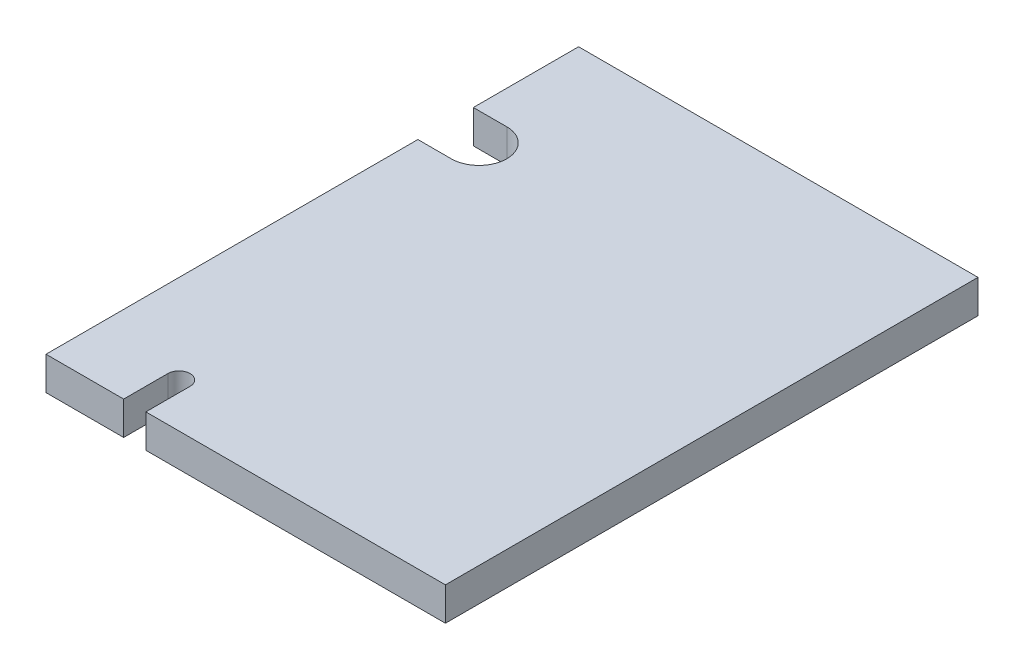
ISO-10303-21;
HEADER;
FILE_DESCRIPTION(('STEP AP214'),'2;1');
FILE_NAME('part.step','',(''),(''),'','','');
FILE_SCHEMA(('AUTOMOTIVE_DESIGN { 1 0 10303 214 1 1 1 1 }'));
ENDSEC;
DATA;
#1=APPLICATION_CONTEXT('core data for automotive mechanical design processes');
#2=APPLICATION_PROTOCOL_DEFINITION('international standard','automotive_design',2000,#1);
#3=PRODUCT_CONTEXT('',#1,'mechanical');
#4=PRODUCT('Part','Part','',(#3));
#5=PRODUCT_RELATED_PRODUCT_CATEGORY('part','',(#4));
#6=PRODUCT_DEFINITION_FORMATION('','',#4);
#7=PRODUCT_DEFINITION_CONTEXT('part definition',#1,'design');
#8=PRODUCT_DEFINITION('design','',#6,#7);
#9=PRODUCT_DEFINITION_SHAPE('','',#8);
#10=(LENGTH_UNIT() NAMED_UNIT(*) SI_UNIT(.MILLI.,.METRE.));
#11=(NAMED_UNIT(*) PLANE_ANGLE_UNIT() SI_UNIT($,.RADIAN.));
#12=(NAMED_UNIT(*) SI_UNIT($,.STERADIAN.) SOLID_ANGLE_UNIT());
#13=UNCERTAINTY_MEASURE_WITH_UNIT(LENGTH_MEASURE(1.E-05),#10,'distance_accuracy_value','');
#14=(GEOMETRIC_REPRESENTATION_CONTEXT(3) GLOBAL_UNCERTAINTY_ASSIGNED_CONTEXT((#13)) GLOBAL_UNIT_ASSIGNED_CONTEXT((#10,
#11,#12)) REPRESENTATION_CONTEXT('',''));
#15=CARTESIAN_POINT('',(0.,0.,0.));
#16=DIRECTION('',(0.,0.,1.));
#17=DIRECTION('',(1.,0.,0.));
#18=AXIS2_PLACEMENT_3D('',#15,#16,#17);
#19=CARTESIAN_POINT('',(0.,19.05,0.));
#20=DIRECTION('',(1.,0.,0.));
#21=DIRECTION('',(0.,0.,-1.));
#22=AXIS2_PLACEMENT_3D('',#19,#20,#21);
#23=PLANE('',#22);
#24=DIRECTION('',(0.,-1.,0.));
#25=VECTOR('',#24,1.);
#26=CARTESIAN_POINT('',(0.,19.05,-244.582325894495));
#27=LINE('',#26,#25);
#28=CARTESIAN_POINT('',(0.,19.05,-244.582325894495));
#29=VERTEX_POINT('',#28);
#30=CARTESIAN_POINT('',(0.,0.,-244.582325894495));
#31=VERTEX_POINT('',#30);
#32=EDGE_CURVE('E161',#29,#31,#27,.T.);
#33=ORIENTED_EDGE('',*,*,#32,.F.);
#34=DIRECTION('',(0.,0.,1.));
#35=VECTOR('',#34,1.);
#36=CARTESIAN_POINT('',(0.,19.05,0.));
#37=LINE('',#36,#35);
#38=CARTESIAN_POINT('',(0.,19.05,-304.8));
#39=VERTEX_POINT('',#38);
#40=EDGE_CURVE('E190',#39,#29,#37,.T.);
#41=ORIENTED_EDGE('',*,*,#40,.F.);
#42=DIRECTION('',(0.,-1.,0.));
#43=VECTOR('',#42,1.);
#44=CARTESIAN_POINT('',(0.,19.05,-304.8));
#45=LINE('',#44,#43);
#46=CARTESIAN_POINT('',(0.,0.,-304.8));
#47=VERTEX_POINT('',#46);
#48=EDGE_CURVE('E196',#39,#47,#45,.T.);
#49=ORIENTED_EDGE('',*,*,#48,.T.);
#50=DIRECTION('',(0.,0.,1.));
#51=VECTOR('',#50,1.);
#52=CARTESIAN_POINT('',(0.,0.,0.));
#53=LINE('',#52,#51);
#54=EDGE_CURVE('E200',#47,#31,#53,.T.);
#55=ORIENTED_EDGE('',*,*,#54,.T.);
#56=EDGE_LOOP('',(#33,#41,#49,#55));
#57=FACE_BOUND('',#56,.T.);
#58=ADVANCED_FACE('F39',(#57),#23,.F.);
#59=CARTESIAN_POINT('',(0.,19.05,0.));
#60=DIRECTION('',(0.,0.,-1.));
#61=DIRECTION('',(-1.,0.,0.));
#62=AXIS2_PLACEMENT_3D('',#59,#60,#61);
#63=PLANE('',#62);
#64=DIRECTION('',(0.,-1.,0.));
#65=VECTOR('',#64,1.);
#66=CARTESIAN_POINT('',(44.4494979671798,19.05,0.));
#67=LINE('',#66,#65);
#68=CARTESIAN_POINT('',(44.4494979671798,19.05,0.));
#69=VERTEX_POINT('',#68);
#70=CARTESIAN_POINT('',(44.4494979671798,0.,0.));
#71=VERTEX_POINT('',#70);
#72=EDGE_CURVE('E168',#69,#71,#67,.T.);
#73=ORIENTED_EDGE('',*,*,#72,.F.);
#74=DIRECTION('',(1.,0.,0.));
#75=VECTOR('',#74,1.);
#76=CARTESIAN_POINT('',(0.,19.05,0.));
#77=LINE('',#76,#75);
#78=CARTESIAN_POINT('',(0.,19.05,0.));
#79=VERTEX_POINT('',#78);
#80=EDGE_CURVE('E192',#79,#69,#77,.T.);
#81=ORIENTED_EDGE('',*,*,#80,.F.);
#82=DIRECTION('',(0.,-1.,0.));
#83=VECTOR('',#82,1.);
#84=CARTESIAN_POINT('',(0.,19.05,0.));
#85=LINE('',#84,#83);
#86=CARTESIAN_POINT('',(0.,0.,0.));
#87=VERTEX_POINT('',#86);
#88=EDGE_CURVE('E11',#79,#87,#85,.T.);
#89=ORIENTED_EDGE('',*,*,#88,.T.);
#90=DIRECTION('',(1.,0.,0.));
#91=VECTOR('',#90,1.);
#92=CARTESIAN_POINT('',(0.,0.,0.));
#93=LINE('',#92,#91);
#94=EDGE_CURVE('E201',#87,#71,#93,.T.);
#95=ORIENTED_EDGE('',*,*,#94,.T.);
#96=EDGE_LOOP('',(#73,#81,#89,#95));
#97=FACE_BOUND('',#96,.T.);
#98=ADVANCED_FACE('F246',(#97),#63,.F.);
#99=CARTESIAN_POINT('',(0.,19.05,-212.832325894495));
#100=VERTEX_POINT('',#99);
#101=EDGE_CURVE('E188',#100,#79,#37,.T.);
#102=ORIENTED_EDGE('',*,*,#101,.F.);
#103=DIRECTION('',(0.,-1.,0.));
#104=VECTOR('',#103,1.);
#105=CARTESIAN_POINT('',(0.,19.05,-212.832325894495));
#106=LINE('',#105,#104);
#107=CARTESIAN_POINT('',(0.,0.,-212.832325894495));
#108=VERTEX_POINT('',#107);
#109=EDGE_CURVE('E140',#100,#108,#106,.T.);
#110=ORIENTED_EDGE('',*,*,#109,.T.);
#111=EDGE_CURVE('E159',#108,#87,#53,.T.);
#112=ORIENTED_EDGE('',*,*,#111,.T.);
#113=ORIENTED_EDGE('',*,*,#88,.F.);
#114=EDGE_LOOP('',(#102,#110,#112,#113));
#115=FACE_BOUND('',#114,.T.);
#116=ADVANCED_FACE('F41',(#115),#23,.F.);
#117=CARTESIAN_POINT('',(57.1494979671798,19.05,0.));
#118=VERTEX_POINT('',#117);
#119=CARTESIAN_POINT('',(228.6,19.05,0.));
#120=VERTEX_POINT('',#119);
#121=EDGE_CURVE('E186',#118,#120,#77,.T.);
#122=ORIENTED_EDGE('',*,*,#121,.F.);
#123=DIRECTION('',(0.,-1.,0.));
#124=VECTOR('',#123,1.);
#125=CARTESIAN_POINT('',(57.1494979671798,19.05,0.));
#126=LINE('',#125,#124);
#127=CARTESIAN_POINT('',(57.1494979671798,0.,0.));
#128=VERTEX_POINT('',#127);
#129=EDGE_CURVE('E170',#118,#128,#126,.T.);
#130=ORIENTED_EDGE('',*,*,#129,.T.);
#131=CARTESIAN_POINT('',(228.6,0.,0.));
#132=VERTEX_POINT('',#131);
#133=EDGE_CURVE('E205',#128,#132,#93,.T.);
#134=ORIENTED_EDGE('',*,*,#133,.T.);
#135=DIRECTION('',(0.,-1.,0.));
#136=VECTOR('',#135,1.);
#137=CARTESIAN_POINT('',(228.6,19.05,0.));
#138=LINE('',#137,#136);
#139=EDGE_CURVE('E50',#120,#132,#138,.T.);
#140=ORIENTED_EDGE('',*,*,#139,.F.);
#141=EDGE_LOOP('',(#122,#130,#134,#140));
#142=FACE_BOUND('',#141,.T.);
#143=ADVANCED_FACE('F240',(#142),#63,.F.);
#144=CARTESIAN_POINT('',(228.6,19.05,0.));
#145=DIRECTION('',(-1.,0.,0.));
#146=DIRECTION('',(0.,0.,1.));
#147=AXIS2_PLACEMENT_3D('',#144,#145,#146);
#148=PLANE('',#147);
#149=DIRECTION('',(0.,0.,-1.));
#150=VECTOR('',#149,1.);
#151=CARTESIAN_POINT('',(228.6,0.,0.));
#152=LINE('',#151,#150);
#153=CARTESIAN_POINT('',(228.6,0.,-304.8));
#154=VERTEX_POINT('',#153);
#155=EDGE_CURVE('E206',#132,#154,#152,.T.);
#156=ORIENTED_EDGE('',*,*,#155,.T.);
#157=DIRECTION('',(0.,-1.,0.));
#158=VECTOR('',#157,1.);
#159=CARTESIAN_POINT('',(228.6,19.05,-304.8));
#160=LINE('',#159,#158);
#161=CARTESIAN_POINT('',(228.6,19.05,-304.8));
#162=VERTEX_POINT('',#161);
#163=EDGE_CURVE('E215',#162,#154,#160,.T.);
#164=ORIENTED_EDGE('',*,*,#163,.F.);
#165=DIRECTION('',(0.,0.,-1.));
#166=VECTOR('',#165,1.);
#167=CARTESIAN_POINT('',(228.6,19.05,0.));
#168=LINE('',#167,#166);
#169=EDGE_CURVE('E191',#120,#162,#168,.T.);
#170=ORIENTED_EDGE('',*,*,#169,.F.);
#171=ORIENTED_EDGE('',*,*,#139,.T.);
#172=EDGE_LOOP('',(#156,#164,#170,#171));
#173=FACE_BOUND('',#172,.T.);
#174=ADVANCED_FACE('F218',(#173),#148,.F.);
#175=CARTESIAN_POINT('',(0.,19.05,-304.8));
#176=DIRECTION('',(0.,0.,1.));
#177=DIRECTION('',(1.,0.,0.));
#178=AXIS2_PLACEMENT_3D('',#175,#176,#177);
#179=PLANE('',#178);
#180=DIRECTION('',(-1.,0.,0.));
#181=VECTOR('',#180,1.);
#182=CARTESIAN_POINT('',(0.,0.,-304.8));
#183=LINE('',#182,#181);
#184=EDGE_CURVE('E208',#154,#47,#183,.T.);
#185=ORIENTED_EDGE('',*,*,#184,.T.);
#186=ORIENTED_EDGE('',*,*,#48,.F.);
#187=DIRECTION('',(-1.,0.,0.));
#188=VECTOR('',#187,1.);
#189=CARTESIAN_POINT('',(0.,19.05,-304.8));
#190=LINE('',#189,#188);
#191=EDGE_CURVE('E198',#162,#39,#190,.T.);
#192=ORIENTED_EDGE('',*,*,#191,.F.);
#193=ORIENTED_EDGE('',*,*,#163,.T.);
#194=EDGE_LOOP('',(#185,#186,#192,#193));
#195=FACE_BOUND('',#194,.T.);
#196=ADVANCED_FACE('F232',(#195),#179,.F.);
#197=CARTESIAN_POINT('',(0.,19.05,0.));
#198=DIRECTION('',(0.,-1.,0.));
#199=DIRECTION('',(0.,0.,-1.));
#200=AXIS2_PLACEMENT_3D('',#197,#198,#199);
#201=PLANE('',#200);
#202=ORIENTED_EDGE('',*,*,#40,.T.);
#203=DIRECTION('',(1.,0.,0.));
#204=VECTOR('',#203,1.);
#205=CARTESIAN_POINT('',(0.,19.05,-244.582325894495));
#206=LINE('',#205,#204);
#207=CARTESIAN_POINT('',(19.1254781425799,19.05,-244.582325894495));
#208=VERTEX_POINT('',#207);
#209=EDGE_CURVE('E139',#29,#208,#206,.T.);
#210=ORIENTED_EDGE('',*,*,#209,.T.);
#211=CARTESIAN_POINT('',(19.1254781425799,19.05,-228.707325894495));
#212=DIRECTION('',(0.,-1.,0.));
#213=DIRECTION('',(0.,0.,1.));
#214=AXIS2_PLACEMENT_3D('',#211,#212,#213);
#215=CIRCLE('',#214,15.875);
#216=CARTESIAN_POINT('',(19.1254781425799,19.05,-212.832325894495));
#217=VERTEX_POINT('',#216);
#218=EDGE_CURVE('E135',#208,#217,#215,.T.);
#219=ORIENTED_EDGE('',*,*,#218,.T.);
#220=DIRECTION('',(-1.,0.,0.));
#221=VECTOR('',#220,1.);
#222=CARTESIAN_POINT('',(19.1254781425799,19.05,-212.832325894495));
#223=LINE('',#222,#221);
#224=EDGE_CURVE('E143',#217,#100,#223,.T.);
#225=ORIENTED_EDGE('',*,*,#224,.T.);
#226=ORIENTED_EDGE('',*,*,#101,.T.);
#227=ORIENTED_EDGE('',*,*,#80,.T.);
#228=DIRECTION('',(0.,0.,-1.));
#229=VECTOR('',#228,1.);
#230=CARTESIAN_POINT('',(44.4494979671798,19.05,-25.3199300821902));
#231=LINE('',#230,#229);
#232=CARTESIAN_POINT('',(44.4494979671798,19.05,-25.3199300821902));
#233=VERTEX_POINT('',#232);
#234=EDGE_CURVE('E167',#69,#233,#231,.T.);
#235=ORIENTED_EDGE('',*,*,#234,.T.);
#236=CARTESIAN_POINT('',(50.7994979671798,19.05,-25.3199300821902));
#237=DIRECTION('',(0.,-1.,0.));
#238=DIRECTION('',(0.,0.,-1.));
#239=AXIS2_PLACEMENT_3D('',#236,#237,#238);
#240=CIRCLE('',#239,6.35);
#241=CARTESIAN_POINT('',(57.1494979671798,19.05,-25.3199300821902));
#242=VERTEX_POINT('',#241);
#243=EDGE_CURVE('E177',#233,#242,#240,.T.);
#244=ORIENTED_EDGE('',*,*,#243,.T.);
#245=DIRECTION('',(0.,0.,1.));
#246=VECTOR('',#245,1.);
#247=CARTESIAN_POINT('',(57.1494979671798,19.05,-25.3199300821902));
#248=LINE('',#247,#246);
#249=EDGE_CURVE('E185',#242,#118,#248,.T.);
#250=ORIENTED_EDGE('',*,*,#249,.T.);
#251=ORIENTED_EDGE('',*,*,#121,.T.);
#252=ORIENTED_EDGE('',*,*,#169,.T.);
#253=ORIENTED_EDGE('',*,*,#191,.T.);
#254=EDGE_LOOP('',(#202,#210,#219,#225,#226,#227,#235,#244,#250,#251,#252,#253));
#255=FACE_BOUND('',#254,.T.);
#256=ADVANCED_FACE('F149',(#255),#201,.F.);
#257=CARTESIAN_POINT('',(0.,0.,0.));
#258=DIRECTION('',(0.,-1.,0.));
#259=DIRECTION('',(0.,0.,-1.));
#260=AXIS2_PLACEMENT_3D('',#257,#258,#259);
#261=PLANE('',#260);
#262=DIRECTION('',(0.,0.,-1.));
#263=VECTOR('',#262,1.);
#264=CARTESIAN_POINT('',(44.4494979671798,0.,-25.3199300821902));
#265=LINE('',#264,#263);
#266=CARTESIAN_POINT('',(44.4494979671798,0.,-25.3199300821902));
#267=VERTEX_POINT('',#266);
#268=EDGE_CURVE('E65',#71,#267,#265,.T.);
#269=ORIENTED_EDGE('',*,*,#268,.F.);
#270=ORIENTED_EDGE('',*,*,#94,.F.);
#271=ORIENTED_EDGE('',*,*,#111,.F.);
#272=DIRECTION('',(-1.,0.,0.));
#273=VECTOR('',#272,1.);
#274=CARTESIAN_POINT('',(19.1254781425799,0.,-212.832325894495));
#275=LINE('',#274,#273);
#276=CARTESIAN_POINT('',(19.1254781425799,0.,-212.832325894495));
#277=VERTEX_POINT('',#276);
#278=EDGE_CURVE('E152',#277,#108,#275,.T.);
#279=ORIENTED_EDGE('',*,*,#278,.F.);
#280=CARTESIAN_POINT('',(19.1254781425799,0.,-228.707325894495));
#281=DIRECTION('',(0.,-1.,0.));
#282=DIRECTION('',(0.,0.,1.));
#283=AXIS2_PLACEMENT_3D('',#280,#281,#282);
#284=CIRCLE('',#283,15.875);
#285=CARTESIAN_POINT('',(19.1254781425799,0.,-244.582325894495));
#286=VERTEX_POINT('',#285);
#287=EDGE_CURVE('E131',#286,#277,#284,.T.);
#288=ORIENTED_EDGE('',*,*,#287,.F.);
#289=DIRECTION('',(1.,0.,0.));
#290=VECTOR('',#289,1.);
#291=CARTESIAN_POINT('',(0.,0.,-244.582325894495));
#292=LINE('',#291,#290);
#293=EDGE_CURVE('E53',#31,#286,#292,.T.);
#294=ORIENTED_EDGE('',*,*,#293,.F.);
#295=ORIENTED_EDGE('',*,*,#54,.F.);
#296=ORIENTED_EDGE('',*,*,#184,.F.);
#297=ORIENTED_EDGE('',*,*,#155,.F.);
#298=ORIENTED_EDGE('',*,*,#133,.F.);
#299=DIRECTION('',(0.,0.,1.));
#300=VECTOR('',#299,1.);
#301=CARTESIAN_POINT('',(57.1494979671798,0.,-25.3199300821902));
#302=LINE('',#301,#300);
#303=CARTESIAN_POINT('',(57.1494979671798,0.,-25.3199300821902));
#304=VERTEX_POINT('',#303);
#305=EDGE_CURVE('E173',#304,#128,#302,.T.);
#306=ORIENTED_EDGE('',*,*,#305,.F.);
#307=CARTESIAN_POINT('',(50.7994979671798,0.,-25.3199300821902));
#308=DIRECTION('',(0.,-1.,0.));
#309=DIRECTION('',(0.,0.,-1.));
#310=AXIS2_PLACEMENT_3D('',#307,#308,#309);
#311=CIRCLE('',#310,6.34999999999999);
#312=EDGE_CURVE('E156',#267,#304,#311,.T.);
#313=ORIENTED_EDGE('',*,*,#312,.F.);
#314=EDGE_LOOP('',(#269,#270,#271,#279,#288,#294,#295,#296,#297,#298,#306,#313));
#315=FACE_BOUND('',#314,.T.);
#316=ADVANCED_FACE('F227',(#315),#261,.T.);
#317=CARTESIAN_POINT('',(44.4494979671798,19.05,-25.3199300821902));
#318=DIRECTION('',(-1.,0.,0.));
#319=DIRECTION('',(0.,0.,1.));
#320=AXIS2_PLACEMENT_3D('',#317,#318,#319);
#321=PLANE('',#320);
#322=ORIENTED_EDGE('',*,*,#268,.T.);
#323=DIRECTION('',(0.,-1.,0.));
#324=VECTOR('',#323,1.);
#325=CARTESIAN_POINT('',(44.4494979671798,19.05,-25.3199300821902));
#326=LINE('',#325,#324);
#327=EDGE_CURVE('E175',#233,#267,#326,.T.);
#328=ORIENTED_EDGE('',*,*,#327,.F.);
#329=ORIENTED_EDGE('',*,*,#234,.F.);
#330=ORIENTED_EDGE('',*,*,#72,.T.);
#331=EDGE_LOOP('',(#322,#328,#329,#330));
#332=FACE_BOUND('',#331,.T.);
#333=ADVANCED_FACE('F243',(#332),#321,.F.);
#334=CARTESIAN_POINT('',(57.1494979671798,19.05,-25.3199300821902));
#335=DIRECTION('',(1.,0.,0.));
#336=DIRECTION('',(0.,0.,-1.));
#337=AXIS2_PLACEMENT_3D('',#334,#335,#336);
#338=PLANE('',#337);
#339=ORIENTED_EDGE('',*,*,#305,.T.);
#340=ORIENTED_EDGE('',*,*,#129,.F.);
#341=ORIENTED_EDGE('',*,*,#249,.F.);
#342=DIRECTION('',(0.,-1.,0.));
#343=VECTOR('',#342,1.);
#344=CARTESIAN_POINT('',(57.1494979671798,19.05,-25.3199300821902));
#345=LINE('',#344,#343);
#346=EDGE_CURVE('E163',#242,#304,#345,.T.);
#347=ORIENTED_EDGE('',*,*,#346,.T.);
#348=EDGE_LOOP('',(#339,#340,#341,#347));
#349=FACE_BOUND('',#348,.T.);
#350=ADVANCED_FACE('F239',(#349),#338,.F.);
#351=CARTESIAN_POINT('',(50.7994979671798,19.05,-25.3199300821902));
#352=DIRECTION('',(0.,-1.,0.));
#353=DIRECTION('',(0.,0.,-1.));
#354=AXIS2_PLACEMENT_3D('',#351,#352,#353);
#355=CYLINDRICAL_SURFACE('',#354,6.34999999999999);
#356=ORIENTED_EDGE('',*,*,#312,.T.);
#357=ORIENTED_EDGE('',*,*,#346,.F.);
#358=ORIENTED_EDGE('',*,*,#243,.F.);
#359=ORIENTED_EDGE('',*,*,#327,.T.);
#360=EDGE_LOOP('',(#356,#357,#358,#359));
#361=FACE_BOUND('',#360,.T.);
#362=ADVANCED_FACE('F244',(#361),#355,.F.);
#363=CARTESIAN_POINT('',(19.1254781425799,19.05,-228.707325894495));
#364=DIRECTION('',(0.,-1.,0.));
#365=DIRECTION('',(0.,0.,-1.));
#366=AXIS2_PLACEMENT_3D('',#363,#364,#365);
#367=CYLINDRICAL_SURFACE('',#366,15.875);
#368=ORIENTED_EDGE('',*,*,#287,.T.);
#369=DIRECTION('',(0.,-1.,0.));
#370=VECTOR('',#369,1.);
#371=CARTESIAN_POINT('',(19.1254781425799,19.05,-212.832325894495));
#372=LINE('',#371,#370);
#373=EDGE_CURVE('E126',#217,#277,#372,.T.);
#374=ORIENTED_EDGE('',*,*,#373,.F.);
#375=ORIENTED_EDGE('',*,*,#218,.F.);
#376=DIRECTION('',(0.,-1.,0.));
#377=VECTOR('',#376,1.);
#378=CARTESIAN_POINT('',(19.1254781425799,19.05,-244.582325894495));
#379=LINE('',#378,#377);
#380=EDGE_CURVE('E158',#208,#286,#379,.T.);
#381=ORIENTED_EDGE('',*,*,#380,.T.);
#382=EDGE_LOOP('',(#368,#374,#375,#381));
#383=FACE_BOUND('',#382,.T.);
#384=ADVANCED_FACE('F128',(#383),#367,.F.);
#385=CARTESIAN_POINT('',(0.,19.05,-244.582325894495));
#386=DIRECTION('',(0.,0.,-1.));
#387=DIRECTION('',(-1.,0.,0.));
#388=AXIS2_PLACEMENT_3D('',#385,#386,#387);
#389=PLANE('',#388);
#390=ORIENTED_EDGE('',*,*,#293,.T.);
#391=ORIENTED_EDGE('',*,*,#380,.F.);
#392=ORIENTED_EDGE('',*,*,#209,.F.);
#393=ORIENTED_EDGE('',*,*,#32,.T.);
#394=EDGE_LOOP('',(#390,#391,#392,#393));
#395=FACE_BOUND('',#394,.T.);
#396=ADVANCED_FACE('F337',(#395),#389,.F.);
#397=CARTESIAN_POINT('',(19.1254781425799,19.05,-212.832325894495));
#398=DIRECTION('',(0.,0.,1.));
#399=DIRECTION('',(1.,0.,0.));
#400=AXIS2_PLACEMENT_3D('',#397,#398,#399);
#401=PLANE('',#400);
#402=ORIENTED_EDGE('',*,*,#278,.T.);
#403=ORIENTED_EDGE('',*,*,#109,.F.);
#404=ORIENTED_EDGE('',*,*,#224,.F.);
#405=ORIENTED_EDGE('',*,*,#373,.T.);
#406=EDGE_LOOP('',(#402,#403,#404,#405));
#407=FACE_BOUND('',#406,.T.);
#408=ADVANCED_FACE('F142',(#407),#401,.F.);
#409=CLOSED_SHELL('',(#58,#98,#116,#143,#174,#196,#256,#316,#333,#350,#362,#384,#396,#408));
#410=MANIFOLD_SOLID_BREP('B2',#409);
#411=ADVANCED_BREP_SHAPE_REPRESENTATION('',(#18,#410),#14);
#412=SHAPE_DEFINITION_REPRESENTATION(#9,#411);
ENDSEC;
END-ISO-10303-21;
